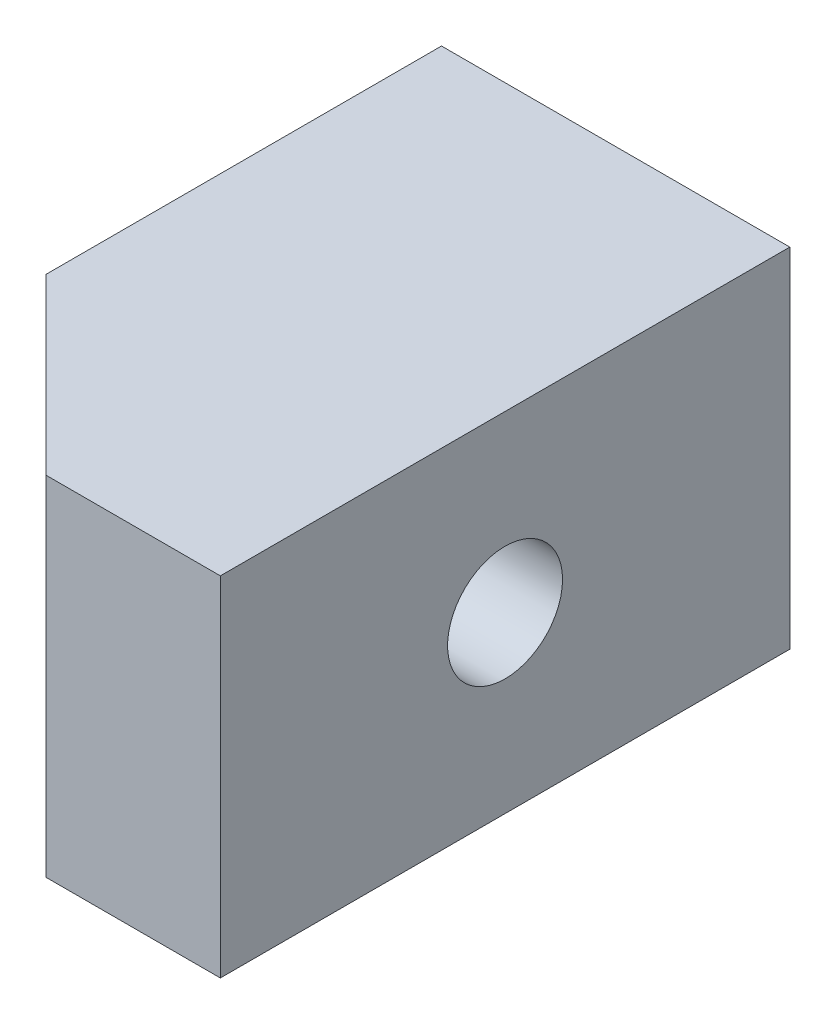
ISO-10303-21;
HEADER;
FILE_DESCRIPTION(('STEP AP214'),'2;1');
FILE_NAME('part.step','',(''),(''),'','','');
FILE_SCHEMA(('AUTOMOTIVE_DESIGN { 1 0 10303 214 1 1 1 1 }'));
ENDSEC;
DATA;
#1=APPLICATION_CONTEXT('core data for automotive mechanical design processes');
#2=APPLICATION_PROTOCOL_DEFINITION('international standard','automotive_design',2000,#1);
#3=PRODUCT_CONTEXT('',#1,'mechanical');
#4=PRODUCT('Part','Part','',(#3));
#5=PRODUCT_RELATED_PRODUCT_CATEGORY('part','',(#4));
#6=PRODUCT_DEFINITION_FORMATION('','',#4);
#7=PRODUCT_DEFINITION_CONTEXT('part definition',#1,'design');
#8=PRODUCT_DEFINITION('design','',#6,#7);
#9=PRODUCT_DEFINITION_SHAPE('','',#8);
#10=(LENGTH_UNIT() NAMED_UNIT(*) SI_UNIT(.MILLI.,.METRE.));
#11=(NAMED_UNIT(*) PLANE_ANGLE_UNIT() SI_UNIT($,.RADIAN.));
#12=(NAMED_UNIT(*) SI_UNIT($,.STERADIAN.) SOLID_ANGLE_UNIT());
#13=UNCERTAINTY_MEASURE_WITH_UNIT(LENGTH_MEASURE(1.E-05),#10,'distance_accuracy_value','');
#14=(GEOMETRIC_REPRESENTATION_CONTEXT(3) GLOBAL_UNCERTAINTY_ASSIGNED_CONTEXT((#13)) GLOBAL_UNIT_ASSIGNED_CONTEXT((#10,
#11,#12)) REPRESENTATION_CONTEXT('',''));
#15=CARTESIAN_POINT('',(0.,0.,0.));
#16=DIRECTION('',(0.,0.,1.));
#17=DIRECTION('',(1.,0.,0.));
#18=AXIS2_PLACEMENT_3D('',#15,#16,#17);
#19=CARTESIAN_POINT('',(5.,10.,8.175));
#20=DIRECTION('',(-1.,0.,0.));
#21=DIRECTION('',(0.,0.,1.));
#22=AXIS2_PLACEMENT_3D('',#19,#20,#21);
#23=PLANE('',#22);
#24=CARTESIAN_POINT('',(5.,5.,0.));
#25=DIRECTION('',(1.,0.,0.));
#26=DIRECTION('',(0.,0.,-1.));
#27=AXIS2_PLACEMENT_3D('',#24,#25,#26);
#28=CIRCLE('',#27,1.64999999999999);
#29=CARTESIAN_POINT('',(5.,5.,-1.64999999999999));
#30=VERTEX_POINT('',#29);
#31=EDGE_CURVE('E109',#30,#30,#28,.T.);
#32=ORIENTED_EDGE('',*,*,#31,.F.);
#33=EDGE_LOOP('',(#32));
#34=FACE_BOUND('',#33,.T.);
#35=DIRECTION('',(0.,0.,-1.));
#36=VECTOR('',#35,1.);
#37=CARTESIAN_POINT('',(5.,0.,8.175));
#38=LINE('',#37,#36);
#39=CARTESIAN_POINT('',(5.,0.,8.175));
#40=VERTEX_POINT('',#39);
#41=CARTESIAN_POINT('',(5.,0.,-8.175));
#42=VERTEX_POINT('',#41);
#43=EDGE_CURVE('E123',#40,#42,#38,.T.);
#44=ORIENTED_EDGE('',*,*,#43,.T.);
#45=DIRECTION('',(0.,-1.,0.));
#46=VECTOR('',#45,1.);
#47=CARTESIAN_POINT('',(5.,10.,-8.175));
#48=LINE('',#47,#46);
#49=CARTESIAN_POINT('',(5.,10.,-8.175));
#50=VERTEX_POINT('',#49);
#51=EDGE_CURVE('E157',#50,#42,#48,.T.);
#52=ORIENTED_EDGE('',*,*,#51,.F.);
#53=DIRECTION('',(0.,0.,-1.));
#54=VECTOR('',#53,1.);
#55=CARTESIAN_POINT('',(5.,10.,8.175));
#56=LINE('',#55,#54);
#57=CARTESIAN_POINT('',(5.,10.,8.175));
#58=VERTEX_POINT('',#57);
#59=EDGE_CURVE('E124',#58,#50,#56,.T.);
#60=ORIENTED_EDGE('',*,*,#59,.F.);
#61=DIRECTION('',(0.,-1.,0.));
#62=VECTOR('',#61,1.);
#63=CARTESIAN_POINT('',(5.,10.,8.175));
#64=LINE('',#63,#62);
#65=EDGE_CURVE('E138',#58,#40,#64,.T.);
#66=ORIENTED_EDGE('',*,*,#65,.T.);
#67=EDGE_LOOP('',(#44,#52,#60,#66));
#68=FACE_BOUND('',#67,.T.);
#69=ADVANCED_FACE('F45',(#34,#68),#23,.F.);
#70=CARTESIAN_POINT('',(-5.,10.,-8.175));
#71=DIRECTION('',(0.,0.,1.));
#72=DIRECTION('',(1.,0.,0.));
#73=AXIS2_PLACEMENT_3D('',#70,#71,#72);
#74=PLANE('',#73);
#75=CARTESIAN_POINT('',(0.,5.,-8.175));
#76=DIRECTION('',(0.,0.,-1.));
#77=DIRECTION('',(-1.,0.,0.));
#78=AXIS2_PLACEMENT_3D('',#75,#76,#77);
#79=CIRCLE('',#78,1.64999999999999);
#80=CARTESIAN_POINT('',(-1.64999999999999,5.,-8.175));
#81=VERTEX_POINT('',#80);
#82=EDGE_CURVE('E110',#81,#81,#79,.T.);
#83=ORIENTED_EDGE('',*,*,#82,.F.);
#84=EDGE_LOOP('',(#83));
#85=FACE_BOUND('',#84,.T.);
#86=DIRECTION('',(-1.,0.,0.));
#87=VECTOR('',#86,1.);
#88=CARTESIAN_POINT('',(-5.,0.,-8.175));
#89=LINE('',#88,#87);
#90=CARTESIAN_POINT('',(-5.,0.,-8.175));
#91=VERTEX_POINT('',#90);
#92=EDGE_CURVE('E142',#42,#91,#89,.T.);
#93=ORIENTED_EDGE('',*,*,#92,.T.);
#94=DIRECTION('',(0.,-1.,0.));
#95=VECTOR('',#94,1.);
#96=CARTESIAN_POINT('',(-5.,10.,-8.175));
#97=LINE('',#96,#95);
#98=CARTESIAN_POINT('',(-5.,10.,-8.175));
#99=VERTEX_POINT('',#98);
#100=EDGE_CURVE('E153',#99,#91,#97,.T.);
#101=ORIENTED_EDGE('',*,*,#100,.F.);
#102=DIRECTION('',(-1.,0.,0.));
#103=VECTOR('',#102,1.);
#104=CARTESIAN_POINT('',(-5.,10.,-8.175));
#105=LINE('',#104,#103);
#106=EDGE_CURVE('E128',#50,#99,#105,.T.);
#107=ORIENTED_EDGE('',*,*,#106,.F.);
#108=ORIENTED_EDGE('',*,*,#51,.T.);
#109=EDGE_LOOP('',(#93,#101,#107,#108));
#110=FACE_BOUND('',#109,.T.);
#111=ADVANCED_FACE('F192',(#85,#110),#74,.F.);
#112=CARTESIAN_POINT('',(-5.,10.,8.175));
#113=DIRECTION('',(1.,0.,0.));
#114=DIRECTION('',(0.,0.,-1.));
#115=AXIS2_PLACEMENT_3D('',#112,#113,#114);
#116=PLANE('',#115);
#117=DIRECTION('',(0.,0.,1.));
#118=VECTOR('',#117,1.);
#119=CARTESIAN_POINT('',(-5.,0.,8.175));
#120=LINE('',#119,#118);
#121=CARTESIAN_POINT('',(-5.,0.,3.17499999999998));
#122=VERTEX_POINT('',#121);
#123=EDGE_CURVE('E145',#91,#122,#120,.T.);
#124=ORIENTED_EDGE('',*,*,#123,.T.);
#125=DIRECTION('',(0.,1.,0.));
#126=VECTOR('',#125,1.);
#127=CARTESIAN_POINT('',(-5.,10.,3.17499999999998));
#128=LINE('',#127,#126);
#129=CARTESIAN_POINT('',(-5.,10.,3.17499999999998));
#130=VERTEX_POINT('',#129);
#131=EDGE_CURVE('E55',#122,#130,#128,.T.);
#132=ORIENTED_EDGE('',*,*,#131,.T.);
#133=DIRECTION('',(0.,0.,1.));
#134=VECTOR('',#133,1.);
#135=CARTESIAN_POINT('',(-5.,10.,8.175));
#136=LINE('',#135,#134);
#137=EDGE_CURVE('E132',#99,#130,#136,.T.);
#138=ORIENTED_EDGE('',*,*,#137,.F.);
#139=ORIENTED_EDGE('',*,*,#100,.T.);
#140=EDGE_LOOP('',(#124,#132,#138,#139));
#141=FACE_BOUND('',#140,.T.);
#142=ADVANCED_FACE('F197',(#141),#116,.F.);
#143=CARTESIAN_POINT('',(-5.,10.,8.175));
#144=DIRECTION('',(0.,0.,-1.));
#145=DIRECTION('',(-1.,0.,0.));
#146=AXIS2_PLACEMENT_3D('',#143,#144,#145);
#147=PLANE('',#146);
#148=DIRECTION('',(1.,0.,0.));
#149=VECTOR('',#148,1.);
#150=CARTESIAN_POINT('',(-5.,10.,8.175));
#151=LINE('',#150,#149);
#152=CARTESIAN_POINT('',(0.,10.,8.175));
#153=VERTEX_POINT('',#152);
#154=EDGE_CURVE('E135',#153,#58,#151,.T.);
#155=ORIENTED_EDGE('',*,*,#154,.F.);
#156=DIRECTION('',(0.,-1.,0.));
#157=VECTOR('',#156,1.);
#158=CARTESIAN_POINT('',(0.,10.,8.175));
#159=LINE('',#158,#157);
#160=CARTESIAN_POINT('',(0.,0.,8.175));
#161=VERTEX_POINT('',#160);
#162=EDGE_CURVE('E161',#153,#161,#159,.T.);
#163=ORIENTED_EDGE('',*,*,#162,.T.);
#164=DIRECTION('',(1.,0.,0.));
#165=VECTOR('',#164,1.);
#166=CARTESIAN_POINT('',(-5.,0.,8.175));
#167=LINE('',#166,#165);
#168=EDGE_CURVE('E129',#161,#40,#167,.T.);
#169=ORIENTED_EDGE('',*,*,#168,.T.);
#170=ORIENTED_EDGE('',*,*,#65,.F.);
#171=EDGE_LOOP('',(#155,#163,#169,#170));
#172=FACE_BOUND('',#171,.T.);
#173=ADVANCED_FACE('F170',(#172),#147,.F.);
#174=CARTESIAN_POINT('',(0.,10.,0.));
#175=DIRECTION('',(0.,-1.,0.));
#176=DIRECTION('',(0.,0.,-1.));
#177=AXIS2_PLACEMENT_3D('',#174,#175,#176);
#178=PLANE('',#177);
#179=ORIENTED_EDGE('',*,*,#137,.T.);
#180=DIRECTION('',(-0.707106781186546,0.,-0.707106781186549));
#181=VECTOR('',#180,1.);
#182=CARTESIAN_POINT('',(0.,10.,8.175));
#183=LINE('',#182,#181);
#184=EDGE_CURVE('E11',#130,#153,#183,.F.);
#185=ORIENTED_EDGE('',*,*,#184,.T.);
#186=ORIENTED_EDGE('',*,*,#154,.T.);
#187=ORIENTED_EDGE('',*,*,#59,.T.);
#188=ORIENTED_EDGE('',*,*,#106,.T.);
#189=EDGE_LOOP('',(#179,#185,#186,#187,#188));
#190=FACE_BOUND('',#189,.T.);
#191=ADVANCED_FACE('F180',(#190),#178,.F.);
#192=CARTESIAN_POINT('',(0.,0.,0.));
#193=DIRECTION('',(0.,-1.,0.));
#194=DIRECTION('',(0.,0.,-1.));
#195=AXIS2_PLACEMENT_3D('',#192,#193,#194);
#196=PLANE('',#195);
#197=ORIENTED_EDGE('',*,*,#168,.F.);
#198=DIRECTION('',(0.707106781186546,0.,0.707106781186549));
#199=VECTOR('',#198,1.);
#200=CARTESIAN_POINT('',(-4.0875,0.,4.08749999999999));
#201=LINE('',#200,#199);
#202=EDGE_CURVE('E69',#161,#122,#201,.F.);
#203=ORIENTED_EDGE('',*,*,#202,.T.);
#204=ORIENTED_EDGE('',*,*,#123,.F.);
#205=ORIENTED_EDGE('',*,*,#92,.F.);
#206=ORIENTED_EDGE('',*,*,#43,.F.);
#207=EDGE_LOOP('',(#197,#203,#204,#205,#206));
#208=FACE_BOUND('',#207,.T.);
#209=ADVANCED_FACE('F175',(#208),#196,.T.);
#210=CARTESIAN_POINT('',(0.,10.,8.175));
#211=DIRECTION('',(0.707106781186549,0.,-0.707106781186546));
#212=DIRECTION('',(0.,-1.,0.));
#213=AXIS2_PLACEMENT_3D('',#210,#211,#212);
#214=PLANE('',#213);
#215=ORIENTED_EDGE('',*,*,#184,.F.);
#216=ORIENTED_EDGE('',*,*,#131,.F.);
#217=ORIENTED_EDGE('',*,*,#202,.F.);
#218=ORIENTED_EDGE('',*,*,#162,.F.);
#219=EDGE_LOOP('',(#215,#216,#217,#218));
#220=FACE_BOUND('',#219,.T.);
#221=ADVANCED_FACE('F48',(#220),#214,.F.);
#222=CARTESIAN_POINT('',(0.175000000000002,5.,0.));
#223=DIRECTION('',(1.,0.,0.));
#224=DIRECTION('',(0.,0.,-1.));
#225=AXIS2_PLACEMENT_3D('',#222,#223,#224);
#226=CONICAL_SURFACE('',#225,1.65,1.02974425867665);
#227=CARTESIAN_POINT('',(-0.816420021395473,5.,0.));
#228=VERTEX_POINT('',#227);
#229=VERTEX_LOOP('',#228);
#230=FACE_BOUND('',#229,.T.);
#231=CARTESIAN_POINT('',(0.175000000000002,5.,0.));
#232=DIRECTION('',(1.,0.,0.));
#233=DIRECTION('',(0.,0.,-1.));
#234=AXIS2_PLACEMENT_3D('',#231,#232,#233);
#235=CIRCLE('',#234,1.65);
#236=CARTESIAN_POINT('',(0.175000000000002,5.,-1.65));
#237=VERTEX_POINT('',#236);
#238=EDGE_CURVE('E115',#237,#237,#235,.T.);
#239=ORIENTED_EDGE('',*,*,#238,.T.);
#240=EDGE_LOOP('',(#239));
#241=FACE_BOUND('',#240,.T.);
#242=ADVANCED_FACE('F183',(#230,#241),#226,.F.);
#243=CARTESIAN_POINT('',(5.,5.,0.));
#244=DIRECTION('',(1.,0.,0.));
#245=DIRECTION('',(0.,0.,-1.));
#246=AXIS2_PLACEMENT_3D('',#243,#244,#245);
#247=CYLINDRICAL_SURFACE('',#246,1.64999999999999);
#248=ORIENTED_EDGE('',*,*,#238,.F.);
#249=EDGE_LOOP('',(#248));
#250=FACE_BOUND('',#249,.T.);
#251=ORIENTED_EDGE('',*,*,#31,.T.);
#252=EDGE_LOOP('',(#251));
#253=FACE_BOUND('',#252,.T.);
#254=ADVANCED_FACE('F102',(#250,#253),#247,.F.);
#255=CARTESIAN_POINT('',(0.,5.,-3.35));
#256=DIRECTION('',(0.,0.,-1.));
#257=DIRECTION('',(-1.,0.,0.));
#258=AXIS2_PLACEMENT_3D('',#255,#256,#257);
#259=CONICAL_SURFACE('',#258,1.65,1.02974425867665);
#260=CARTESIAN_POINT('',(0.,5.,-2.35857997860453));
#261=VERTEX_POINT('',#260);
#262=VERTEX_LOOP('',#261);
#263=FACE_BOUND('',#262,.T.);
#264=CARTESIAN_POINT('',(0.,5.,-3.35));
#265=DIRECTION('',(0.,0.,-1.));
#266=DIRECTION('',(-1.,0.,0.));
#267=AXIS2_PLACEMENT_3D('',#264,#265,#266);
#268=CIRCLE('',#267,1.65);
#269=CARTESIAN_POINT('',(-1.65,5.,-3.35));
#270=VERTEX_POINT('',#269);
#271=EDGE_CURVE('E106',#270,#270,#268,.T.);
#272=ORIENTED_EDGE('',*,*,#271,.T.);
#273=EDGE_LOOP('',(#272));
#274=FACE_BOUND('',#273,.T.);
#275=ADVANCED_FACE('F98',(#263,#274),#259,.F.);
#276=CARTESIAN_POINT('',(0.,5.,-8.175));
#277=DIRECTION('',(0.,0.,-1.));
#278=DIRECTION('',(-1.,0.,0.));
#279=AXIS2_PLACEMENT_3D('',#276,#277,#278);
#280=CYLINDRICAL_SURFACE('',#279,1.64999999999999);
#281=ORIENTED_EDGE('',*,*,#271,.F.);
#282=EDGE_LOOP('',(#281));
#283=FACE_BOUND('',#282,.T.);
#284=ORIENTED_EDGE('',*,*,#82,.T.);
#285=EDGE_LOOP('',(#284));
#286=FACE_BOUND('',#285,.T.);
#287=ADVANCED_FACE('F101',(#283,#286),#280,.F.);
#288=CLOSED_SHELL('',(#69,#111,#142,#173,#191,#209,#221,#242,#254,#275,#287));
#289=MANIFOLD_SOLID_BREP('B2',#288);
#290=ADVANCED_BREP_SHAPE_REPRESENTATION('',(#18,#289),#14);
#291=SHAPE_DEFINITION_REPRESENTATION(#9,#290);
ENDSEC;
END-ISO-10303-21;
